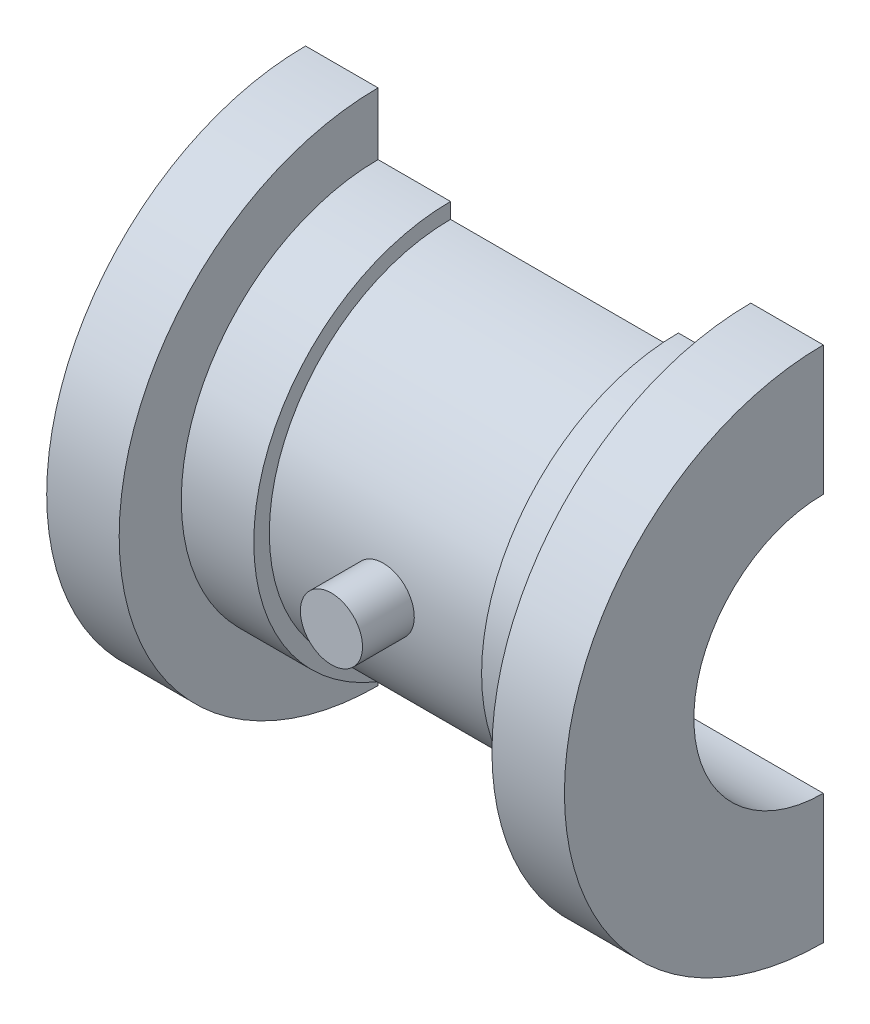
ISO-10303-21;
HEADER;
FILE_DESCRIPTION(('STEP AP214'),'2;1');
FILE_NAME('part.step','',(''),(''),'','','');
FILE_SCHEMA(('AUTOMOTIVE_DESIGN { 1 0 10303 214 1 1 1 1 }'));
ENDSEC;
DATA;
#1=APPLICATION_CONTEXT('core data for automotive mechanical design processes');
#2=APPLICATION_PROTOCOL_DEFINITION('international standard','automotive_design',2000,#1);
#3=PRODUCT_CONTEXT('',#1,'mechanical');
#4=PRODUCT('Part','Part','',(#3));
#5=PRODUCT_RELATED_PRODUCT_CATEGORY('part','',(#4));
#6=PRODUCT_DEFINITION_FORMATION('','',#4);
#7=PRODUCT_DEFINITION_CONTEXT('part definition',#1,'design');
#8=PRODUCT_DEFINITION('design','',#6,#7);
#9=PRODUCT_DEFINITION_SHAPE('','',#8);
#10=(LENGTH_UNIT() NAMED_UNIT(*) SI_UNIT(.MILLI.,.METRE.));
#11=(NAMED_UNIT(*) PLANE_ANGLE_UNIT() SI_UNIT($,.RADIAN.));
#12=(NAMED_UNIT(*) SI_UNIT($,.STERADIAN.) SOLID_ANGLE_UNIT());
#13=UNCERTAINTY_MEASURE_WITH_UNIT(LENGTH_MEASURE(1.E-05),#10,'distance_accuracy_value','');
#14=(GEOMETRIC_REPRESENTATION_CONTEXT(3) GLOBAL_UNCERTAINTY_ASSIGNED_CONTEXT((#13)) GLOBAL_UNIT_ASSIGNED_CONTEXT((#10,
#11,#12)) REPRESENTATION_CONTEXT('',''));
#15=CARTESIAN_POINT('',(0.,0.,0.));
#16=DIRECTION('',(0.,0.,1.));
#17=DIRECTION('',(1.,0.,0.));
#18=AXIS2_PLACEMENT_3D('',#15,#16,#17);
#19=CARTESIAN_POINT('',(0.,-1.57116660247941E-13,22.5));
#20=DIRECTION('',(0.,0.,-1.));
#21=DIRECTION('',(0.,1.,0.));
#22=AXIS2_PLACEMENT_3D('',#19,#20,#21);
#23=CYLINDRICAL_SURFACE('',#22,3.);
#24=CARTESIAN_POINT('',(0.,-1.57116660247941E-13,22.5));
#25=DIRECTION('',(0.,0.,-1.));
#26=DIRECTION('',(0.,1.,0.));
#27=AXIS2_PLACEMENT_3D('',#24,#25,#26);
#28=CIRCLE('',#27,3.);
#29=CARTESIAN_POINT('',(0.,2.99999999999984,22.5));
#30=VERTEX_POINT('',#29);
#31=EDGE_CURVE('E11',#30,#30,#28,.T.);
#32=ORIENTED_EDGE('',*,*,#31,.T.);
#33=EDGE_LOOP('',(#32));
#34=FACE_BOUND('',#33,.T.);
#35=CARTESIAN_POINT('',(0.,-1.2220184685951E-13,17.5));
#36=DIRECTION('',(0.,0.,-1.));
#37=DIRECTION('',(0.,1.,0.));
#38=AXIS2_PLACEMENT_3D('',#35,#36,#37);
#39=CIRCLE('',#38,3.);
#40=CARTESIAN_POINT('',(0.,2.99999999999988,17.5));
#41=VERTEX_POINT('',#40);
#42=EDGE_CURVE('E48',#41,#41,#39,.T.);
#43=ORIENTED_EDGE('',*,*,#42,.F.);
#44=EDGE_LOOP('',(#43));
#45=FACE_BOUND('',#44,.T.);
#46=ADVANCED_FACE('F45',(#34,#45),#23,.T.);
#47=CARTESIAN_POINT('',(0.,-1.57116660247941E-13,22.5));
#48=DIRECTION('',(0.,0.,-1.));
#49=DIRECTION('',(0.,1.,0.));
#50=AXIS2_PLACEMENT_3D('',#47,#48,#49);
#51=PLANE('',#50);
#52=ORIENTED_EDGE('',*,*,#31,.F.);
#53=EDGE_LOOP('',(#52));
#54=FACE_BOUND('',#53,.T.);
#55=ADVANCED_FACE('F60',(#54),#51,.F.);
#56=CARTESIAN_POINT('',(0.,-1.2220184685951E-13,17.5));
#57=DIRECTION('',(0.,0.,-1.));
#58=DIRECTION('',(0.,1.,0.));
#59=AXIS2_PLACEMENT_3D('',#56,#57,#58);
#60=PLANE('',#59);
#61=ORIENTED_EDGE('',*,*,#42,.T.);
#62=EDGE_LOOP('',(#61));
#63=FACE_BOUND('',#62,.T.);
#64=ADVANCED_FACE('F57',(#63),#60,.T.);
#65=CLOSED_SHELL('',(#46,#55,#64));
#66=MANIFOLD_SOLID_BREP('B2',#65);
#67=CARTESIAN_POINT('',(0.,0.,0.));
#68=DIRECTION('',(0.,0.,1.));
#69=DIRECTION('',(-1.,0.,0.));
#70=AXIS2_PLACEMENT_3D('',#67,#68,#69);
#71=PLANE('',#70);
#72=DIRECTION('',(0.,-1.,0.));
#73=VECTOR('',#72,1.);
#74=CARTESIAN_POINT('',(25.,0.,0.));
#75=LINE('',#74,#73);
#76=CARTESIAN_POINT('',(25.,25.,0.));
#77=VERTEX_POINT('',#76);
#78=CARTESIAN_POINT('',(25.,12.5,-1.74574066942157E-13));
#79=VERTEX_POINT('',#78);
#80=EDGE_CURVE('E180',#77,#79,#75,.T.);
#81=ORIENTED_EDGE('',*,*,#80,.T.);
#82=DIRECTION('',(-1.,0.,0.));
#83=VECTOR('',#82,1.);
#84=CARTESIAN_POINT('',(25.,12.5,-1.74574066942157E-13));
#85=LINE('',#84,#83);
#86=CARTESIAN_POINT('',(-25.,12.5,-1.74574066942157E-13));
#87=VERTEX_POINT('',#86);
#88=EDGE_CURVE('E167',#79,#87,#85,.T.);
#89=ORIENTED_EDGE('',*,*,#88,.T.);
#90=DIRECTION('',(0.,1.,0.));
#91=VECTOR('',#90,1.);
#92=CARTESIAN_POINT('',(-25.,0.,0.));
#93=LINE('',#92,#91);
#94=CARTESIAN_POINT('',(-25.,25.,0.));
#95=VERTEX_POINT('',#94);
#96=EDGE_CURVE('E246',#87,#95,#93,.T.);
#97=ORIENTED_EDGE('',*,*,#96,.T.);
#98=DIRECTION('',(-1.,0.,0.));
#99=VECTOR('',#98,1.);
#100=CARTESIAN_POINT('',(-25.,25.,0.));
#101=LINE('',#100,#99);
#102=CARTESIAN_POINT('',(-18.,25.,0.));
#103=VERTEX_POINT('',#102);
#104=EDGE_CURVE('E236',#103,#95,#101,.T.);
#105=ORIENTED_EDGE('',*,*,#104,.F.);
#106=DIRECTION('',(0.,1.,0.));
#107=VECTOR('',#106,1.);
#108=CARTESIAN_POINT('',(-18.,25.,0.));
#109=LINE('',#108,#107);
#110=CARTESIAN_POINT('',(-18.,19.,0.));
#111=VERTEX_POINT('',#110);
#112=EDGE_CURVE('E240',#111,#103,#109,.T.);
#113=ORIENTED_EDGE('',*,*,#112,.F.);
#114=DIRECTION('',(-1.,0.,0.));
#115=VECTOR('',#114,1.);
#116=CARTESIAN_POINT('',(-18.,19.,0.));
#117=LINE('',#116,#115);
#118=CARTESIAN_POINT('',(-11.,19.,0.));
#119=VERTEX_POINT('',#118);
#120=EDGE_CURVE('E244',#119,#111,#117,.T.);
#121=ORIENTED_EDGE('',*,*,#120,.F.);
#122=DIRECTION('',(0.,1.,0.));
#123=VECTOR('',#122,1.);
#124=CARTESIAN_POINT('',(-11.,19.,0.));
#125=LINE('',#124,#123);
#126=CARTESIAN_POINT('',(-11.,17.5,0.));
#127=VERTEX_POINT('',#126);
#128=EDGE_CURVE('E249',#127,#119,#125,.T.);
#129=ORIENTED_EDGE('',*,*,#128,.F.);
#130=DIRECTION('',(-1.,0.,0.));
#131=VECTOR('',#130,1.);
#132=CARTESIAN_POINT('',(-11.,17.5,0.));
#133=LINE('',#132,#131);
#134=CARTESIAN_POINT('',(11.,17.5,0.));
#135=VERTEX_POINT('',#134);
#136=EDGE_CURVE('E252',#135,#127,#133,.T.);
#137=ORIENTED_EDGE('',*,*,#136,.F.);
#138=DIRECTION('',(0.,-1.,0.));
#139=VECTOR('',#138,1.);
#140=CARTESIAN_POINT('',(11.,19.,0.));
#141=LINE('',#140,#139);
#142=CARTESIAN_POINT('',(11.,19.,0.));
#143=VERTEX_POINT('',#142);
#144=EDGE_CURVE('E255',#143,#135,#141,.T.);
#145=ORIENTED_EDGE('',*,*,#144,.F.);
#146=DIRECTION('',(-1.,0.,0.));
#147=VECTOR('',#146,1.);
#148=CARTESIAN_POINT('',(18.,19.,0.));
#149=LINE('',#148,#147);
#150=CARTESIAN_POINT('',(18.,19.,0.));
#151=VERTEX_POINT('',#150);
#152=EDGE_CURVE('E258',#151,#143,#149,.T.);
#153=ORIENTED_EDGE('',*,*,#152,.F.);
#154=DIRECTION('',(0.,-1.,0.));
#155=VECTOR('',#154,1.);
#156=CARTESIAN_POINT('',(18.,25.,0.));
#157=LINE('',#156,#155);
#158=CARTESIAN_POINT('',(18.,25.,0.));
#159=VERTEX_POINT('',#158);
#160=EDGE_CURVE('E261',#159,#151,#157,.T.);
#161=ORIENTED_EDGE('',*,*,#160,.F.);
#162=DIRECTION('',(-1.,0.,0.));
#163=VECTOR('',#162,1.);
#164=CARTESIAN_POINT('',(25.,25.,0.));
#165=LINE('',#164,#163);
#166=EDGE_CURVE('E187',#77,#159,#165,.T.);
#167=ORIENTED_EDGE('',*,*,#166,.F.);
#168=EDGE_LOOP('',(#81,#89,#97,#105,#113,#121,#129,#137,#145,#153,#161,#167));
#169=FACE_BOUND('',#168,.T.);
#170=ADVANCED_FACE('F80',(#169),#71,.F.);
#171=CARTESIAN_POINT('',(-25.,0.,0.));
#172=DIRECTION('',(1.,0.,0.));
#173=DIRECTION('',(0.,1.,0.));
#174=AXIS2_PLACEMENT_3D('',#171,#172,#173);
#175=PLANE('',#174);
#176=ORIENTED_EDGE('',*,*,#96,.F.);
#177=CARTESIAN_POINT('',(-25.,0.,0.));
#178=DIRECTION('',(-1.,0.,0.));
#179=DIRECTION('',(0.,-1.,0.));
#180=AXIS2_PLACEMENT_3D('',#177,#178,#179);
#181=CIRCLE('',#180,12.5);
#182=CARTESIAN_POINT('',(-25.,-12.5,-1.74574066942157E-13));
#183=VERTEX_POINT('',#182);
#184=EDGE_CURVE('E170',#183,#87,#181,.T.);
#185=ORIENTED_EDGE('',*,*,#184,.F.);
#186=CARTESIAN_POINT('',(-25.,-25.,-1.74574066942157E-13));
#187=VERTEX_POINT('',#186);
#188=EDGE_CURVE('E193',#187,#183,#93,.T.);
#189=ORIENTED_EDGE('',*,*,#188,.F.);
#190=CARTESIAN_POINT('',(-25.,0.,0.));
#191=DIRECTION('',(-1.,0.,0.));
#192=DIRECTION('',(0.,-1.,0.));
#193=AXIS2_PLACEMENT_3D('',#190,#191,#192);
#194=CIRCLE('',#193,25.);
#195=EDGE_CURVE('E43',#187,#95,#194,.T.);
#196=ORIENTED_EDGE('',*,*,#195,.T.);
#197=EDGE_LOOP('',(#176,#185,#189,#196));
#198=FACE_BOUND('',#197,.T.);
#199=ADVANCED_FACE('F270',(#198),#175,.F.);
#200=CARTESIAN_POINT('',(-38.9493607052265,0.,0.));
#201=DIRECTION('',(-1.,0.,0.));
#202=DIRECTION('',(0.,-1.,0.));
#203=AXIS2_PLACEMENT_3D('',#200,#201,#202);
#204=CYLINDRICAL_SURFACE('',#203,25.);
#205=CARTESIAN_POINT('',(-18.,0.,0.));
#206=DIRECTION('',(-1.,0.,0.));
#207=DIRECTION('',(0.,-1.,0.));
#208=AXIS2_PLACEMENT_3D('',#205,#206,#207);
#209=CIRCLE('',#208,25.);
#210=CARTESIAN_POINT('',(-18.,-25.,-1.74574066942157E-13));
#211=VERTEX_POINT('',#210);
#212=EDGE_CURVE('E88',#211,#103,#209,.T.);
#213=ORIENTED_EDGE('',*,*,#212,.T.);
#214=ORIENTED_EDGE('',*,*,#104,.T.);
#215=ORIENTED_EDGE('',*,*,#195,.F.);
#216=DIRECTION('',(-1.,0.,0.));
#217=VECTOR('',#216,1.);
#218=CARTESIAN_POINT('',(-25.,-25.,-1.74574066942157E-13));
#219=LINE('',#218,#217);
#220=EDGE_CURVE('E217',#211,#187,#219,.T.);
#221=ORIENTED_EDGE('',*,*,#220,.F.);
#222=EDGE_LOOP('',(#213,#214,#215,#221));
#223=FACE_BOUND('',#222,.T.);
#224=ADVANCED_FACE('F82',(#223),#204,.T.);
#225=CARTESIAN_POINT('',(-18.,-25.,-1.74574066942157E-13));
#226=DIRECTION('',(-1.,0.,0.));
#227=DIRECTION('',(0.,-1.,0.));
#228=AXIS2_PLACEMENT_3D('',#225,#226,#227);
#229=PLANE('',#228);
#230=CARTESIAN_POINT('',(-18.,0.,0.));
#231=DIRECTION('',(-1.,0.,0.));
#232=DIRECTION('',(0.,-1.,0.));
#233=AXIS2_PLACEMENT_3D('',#230,#231,#232);
#234=CIRCLE('',#233,19.);
#235=CARTESIAN_POINT('',(-18.,-19.,-1.32676290876039E-13));
#236=VERTEX_POINT('',#235);
#237=EDGE_CURVE('E233',#236,#111,#234,.T.);
#238=ORIENTED_EDGE('',*,*,#237,.T.);
#239=ORIENTED_EDGE('',*,*,#112,.T.);
#240=ORIENTED_EDGE('',*,*,#212,.F.);
#241=DIRECTION('',(0.,-1.,0.));
#242=VECTOR('',#241,1.);
#243=CARTESIAN_POINT('',(-18.,-25.,-1.74574066942157E-13));
#244=LINE('',#243,#242);
#245=EDGE_CURVE('E214',#236,#211,#244,.T.);
#246=ORIENTED_EDGE('',*,*,#245,.F.);
#247=EDGE_LOOP('',(#238,#239,#240,#246));
#248=FACE_BOUND('',#247,.T.);
#249=ADVANCED_FACE('F241',(#248),#229,.F.);
#250=CARTESIAN_POINT('',(-38.9493607052265,0.,0.));
#251=DIRECTION('',(-1.,0.,0.));
#252=DIRECTION('',(0.,-1.,0.));
#253=AXIS2_PLACEMENT_3D('',#250,#251,#252);
#254=CYLINDRICAL_SURFACE('',#253,19.);
#255=CARTESIAN_POINT('',(-11.,0.,0.));
#256=DIRECTION('',(-1.,0.,0.));
#257=DIRECTION('',(0.,-1.,0.));
#258=AXIS2_PLACEMENT_3D('',#255,#256,#257);
#259=CIRCLE('',#258,19.);
#260=CARTESIAN_POINT('',(-11.,-19.,-1.32676290876039E-13));
#261=VERTEX_POINT('',#260);
#262=EDGE_CURVE('E231',#261,#119,#259,.T.);
#263=ORIENTED_EDGE('',*,*,#262,.T.);
#264=ORIENTED_EDGE('',*,*,#120,.T.);
#265=ORIENTED_EDGE('',*,*,#237,.F.);
#266=DIRECTION('',(-1.,0.,0.));
#267=VECTOR('',#266,1.);
#268=CARTESIAN_POINT('',(-18.,-19.,-1.32676290876039E-13));
#269=LINE('',#268,#267);
#270=EDGE_CURVE('E211',#261,#236,#269,.T.);
#271=ORIENTED_EDGE('',*,*,#270,.F.);
#272=EDGE_LOOP('',(#263,#264,#265,#271));
#273=FACE_BOUND('',#272,.T.);
#274=ADVANCED_FACE('F275',(#273),#254,.T.);
#275=CARTESIAN_POINT('',(-11.,-19.,-1.32676290876039E-13));
#276=DIRECTION('',(-1.,0.,0.));
#277=DIRECTION('',(0.,-1.,0.));
#278=AXIS2_PLACEMENT_3D('',#275,#276,#277);
#279=PLANE('',#278);
#280=CARTESIAN_POINT('',(-11.,0.,0.));
#281=DIRECTION('',(-1.,0.,0.));
#282=DIRECTION('',(0.,-1.,0.));
#283=AXIS2_PLACEMENT_3D('',#280,#281,#282);
#284=CIRCLE('',#283,17.5);
#285=CARTESIAN_POINT('',(-11.,-17.5,-1.2220184685951E-13));
#286=VERTEX_POINT('',#285);
#287=EDGE_CURVE('E229',#286,#127,#284,.T.);
#288=ORIENTED_EDGE('',*,*,#287,.T.);
#289=ORIENTED_EDGE('',*,*,#128,.T.);
#290=ORIENTED_EDGE('',*,*,#262,.F.);
#291=DIRECTION('',(0.,-1.,0.));
#292=VECTOR('',#291,1.);
#293=CARTESIAN_POINT('',(-11.,-19.,-1.32676290876039E-13));
#294=LINE('',#293,#292);
#295=EDGE_CURVE('E208',#286,#261,#294,.T.);
#296=ORIENTED_EDGE('',*,*,#295,.F.);
#297=EDGE_LOOP('',(#288,#289,#290,#296));
#298=FACE_BOUND('',#297,.T.);
#299=ADVANCED_FACE('F280',(#298),#279,.F.);
#300=CARTESIAN_POINT('',(-38.9493607052265,0.,0.));
#301=DIRECTION('',(-1.,0.,0.));
#302=DIRECTION('',(0.,-1.,0.));
#303=AXIS2_PLACEMENT_3D('',#300,#301,#302);
#304=CYLINDRICAL_SURFACE('',#303,17.5);
#305=CARTESIAN_POINT('',(11.,0.,0.));
#306=DIRECTION('',(-1.,0.,0.));
#307=DIRECTION('',(0.,-1.,0.));
#308=AXIS2_PLACEMENT_3D('',#305,#306,#307);
#309=CIRCLE('',#308,17.5);
#310=CARTESIAN_POINT('',(11.,-17.5,-1.2220184685951E-13));
#311=VERTEX_POINT('',#310);
#312=EDGE_CURVE('E227',#311,#135,#309,.T.);
#313=ORIENTED_EDGE('',*,*,#312,.T.);
#314=ORIENTED_EDGE('',*,*,#136,.T.);
#315=ORIENTED_EDGE('',*,*,#287,.F.);
#316=DIRECTION('',(-1.,0.,0.));
#317=VECTOR('',#316,1.);
#318=CARTESIAN_POINT('',(-11.,-17.5,-1.2220184685951E-13));
#319=LINE('',#318,#317);
#320=EDGE_CURVE('E205',#311,#286,#319,.T.);
#321=ORIENTED_EDGE('',*,*,#320,.F.);
#322=EDGE_LOOP('',(#313,#314,#315,#321));
#323=FACE_BOUND('',#322,.T.);
#324=ADVANCED_FACE('F283',(#323),#304,.T.);
#325=CARTESIAN_POINT('',(11.,-19.,-1.32676290876039E-13));
#326=DIRECTION('',(1.,0.,0.));
#327=DIRECTION('',(0.,1.,0.));
#328=AXIS2_PLACEMENT_3D('',#325,#326,#327);
#329=PLANE('',#328);
#330=CARTESIAN_POINT('',(11.,0.,0.));
#331=DIRECTION('',(-1.,0.,0.));
#332=DIRECTION('',(0.,-1.,0.));
#333=AXIS2_PLACEMENT_3D('',#330,#331,#332);
#334=CIRCLE('',#333,19.);
#335=CARTESIAN_POINT('',(11.,-19.,-1.32676290876039E-13));
#336=VERTEX_POINT('',#335);
#337=EDGE_CURVE('E225',#336,#143,#334,.T.);
#338=ORIENTED_EDGE('',*,*,#337,.T.);
#339=ORIENTED_EDGE('',*,*,#144,.T.);
#340=ORIENTED_EDGE('',*,*,#312,.F.);
#341=DIRECTION('',(0.,1.,0.));
#342=VECTOR('',#341,1.);
#343=CARTESIAN_POINT('',(11.,-19.,-1.32676290876039E-13));
#344=LINE('',#343,#342);
#345=EDGE_CURVE('E202',#336,#311,#344,.T.);
#346=ORIENTED_EDGE('',*,*,#345,.F.);
#347=EDGE_LOOP('',(#338,#339,#340,#346));
#348=FACE_BOUND('',#347,.T.);
#349=ADVANCED_FACE('F286',(#348),#329,.F.);
#350=CARTESIAN_POINT('',(-38.9493607052265,0.,0.));
#351=DIRECTION('',(-1.,0.,0.));
#352=DIRECTION('',(0.,-1.,0.));
#353=AXIS2_PLACEMENT_3D('',#350,#351,#352);
#354=CYLINDRICAL_SURFACE('',#353,19.);
#355=CARTESIAN_POINT('',(18.,0.,0.));
#356=DIRECTION('',(-1.,0.,0.));
#357=DIRECTION('',(0.,-1.,0.));
#358=AXIS2_PLACEMENT_3D('',#355,#356,#357);
#359=CIRCLE('',#358,19.);
#360=CARTESIAN_POINT('',(18.,-19.,-1.32676290876039E-13));
#361=VERTEX_POINT('',#360);
#362=EDGE_CURVE('E223',#361,#151,#359,.T.);
#363=ORIENTED_EDGE('',*,*,#362,.T.);
#364=ORIENTED_EDGE('',*,*,#152,.T.);
#365=ORIENTED_EDGE('',*,*,#337,.F.);
#366=DIRECTION('',(-1.,0.,0.));
#367=VECTOR('',#366,1.);
#368=CARTESIAN_POINT('',(18.,-19.,-1.32676290876039E-13));
#369=LINE('',#368,#367);
#370=EDGE_CURVE('E199',#361,#336,#369,.T.);
#371=ORIENTED_EDGE('',*,*,#370,.F.);
#372=EDGE_LOOP('',(#363,#364,#365,#371));
#373=FACE_BOUND('',#372,.T.);
#374=ADVANCED_FACE('F289',(#373),#354,.T.);
#375=CARTESIAN_POINT('',(18.,-25.,-1.74574066942157E-13));
#376=DIRECTION('',(1.,0.,0.));
#377=DIRECTION('',(0.,1.,0.));
#378=AXIS2_PLACEMENT_3D('',#375,#376,#377);
#379=PLANE('',#378);
#380=CARTESIAN_POINT('',(18.,0.,0.));
#381=DIRECTION('',(-1.,0.,0.));
#382=DIRECTION('',(0.,-1.,0.));
#383=AXIS2_PLACEMENT_3D('',#380,#381,#382);
#384=CIRCLE('',#383,25.);
#385=CARTESIAN_POINT('',(18.,-25.,-1.74574066942157E-13));
#386=VERTEX_POINT('',#385);
#387=EDGE_CURVE('E221',#386,#159,#384,.T.);
#388=ORIENTED_EDGE('',*,*,#387,.T.);
#389=ORIENTED_EDGE('',*,*,#160,.T.);
#390=ORIENTED_EDGE('',*,*,#362,.F.);
#391=DIRECTION('',(0.,1.,0.));
#392=VECTOR('',#391,1.);
#393=CARTESIAN_POINT('',(18.,-25.,-1.74574066942157E-13));
#394=LINE('',#393,#392);
#395=EDGE_CURVE('E191',#386,#361,#394,.T.);
#396=ORIENTED_EDGE('',*,*,#395,.F.);
#397=EDGE_LOOP('',(#388,#389,#390,#396));
#398=FACE_BOUND('',#397,.T.);
#399=ADVANCED_FACE('F293',(#398),#379,.F.);
#400=CARTESIAN_POINT('',(-38.9493607052265,0.,0.));
#401=DIRECTION('',(-1.,0.,0.));
#402=DIRECTION('',(0.,-1.,0.));
#403=AXIS2_PLACEMENT_3D('',#400,#401,#402);
#404=CYLINDRICAL_SURFACE('',#403,25.);
#405=CARTESIAN_POINT('',(25.,0.,0.));
#406=DIRECTION('',(-1.,0.,0.));
#407=DIRECTION('',(0.,-1.,0.));
#408=AXIS2_PLACEMENT_3D('',#405,#406,#407);
#409=CIRCLE('',#408,25.);
#410=CARTESIAN_POINT('',(25.,-25.,-1.74574066942157E-13));
#411=VERTEX_POINT('',#410);
#412=EDGE_CURVE('E219',#411,#77,#409,.T.);
#413=ORIENTED_EDGE('',*,*,#412,.T.);
#414=ORIENTED_EDGE('',*,*,#166,.T.);
#415=ORIENTED_EDGE('',*,*,#387,.F.);
#416=DIRECTION('',(-1.,0.,0.));
#417=VECTOR('',#416,1.);
#418=CARTESIAN_POINT('',(25.,-25.,-1.74574066942157E-13));
#419=LINE('',#418,#417);
#420=EDGE_CURVE('E188',#411,#386,#419,.T.);
#421=ORIENTED_EDGE('',*,*,#420,.F.);
#422=EDGE_LOOP('',(#413,#414,#415,#421));
#423=FACE_BOUND('',#422,.T.);
#424=ADVANCED_FACE('F296',(#423),#404,.T.);
#425=CARTESIAN_POINT('',(25.,0.,0.));
#426=DIRECTION('',(-1.,0.,0.));
#427=DIRECTION('',(0.,-1.,0.));
#428=AXIS2_PLACEMENT_3D('',#425,#426,#427);
#429=PLANE('',#428);
#430=CARTESIAN_POINT('',(25.,-12.5,0.));
#431=VERTEX_POINT('',#430);
#432=EDGE_CURVE('E182',#431,#411,#75,.T.);
#433=ORIENTED_EDGE('',*,*,#432,.F.);
#434=CARTESIAN_POINT('',(25.,0.,0.));
#435=DIRECTION('',(-1.,0.,0.));
#436=DIRECTION('',(0.,-1.,0.));
#437=AXIS2_PLACEMENT_3D('',#434,#435,#436);
#438=CIRCLE('',#437,12.5);
#439=EDGE_CURVE('E95',#431,#79,#438,.T.);
#440=ORIENTED_EDGE('',*,*,#439,.T.);
#441=ORIENTED_EDGE('',*,*,#80,.F.);
#442=ORIENTED_EDGE('',*,*,#412,.F.);
#443=EDGE_LOOP('',(#433,#440,#441,#442));
#444=FACE_BOUND('',#443,.T.);
#445=ADVANCED_FACE('F178',(#444),#429,.F.);
#446=ORIENTED_EDGE('',*,*,#188,.T.);
#447=DIRECTION('',(-1.,0.,0.));
#448=VECTOR('',#447,1.);
#449=CARTESIAN_POINT('',(25.,-12.5,-1.74574066942157E-13));
#450=LINE('',#449,#448);
#451=EDGE_CURVE('E174',#431,#183,#450,.T.);
#452=ORIENTED_EDGE('',*,*,#451,.F.);
#453=ORIENTED_EDGE('',*,*,#432,.T.);
#454=ORIENTED_EDGE('',*,*,#420,.T.);
#455=ORIENTED_EDGE('',*,*,#395,.T.);
#456=ORIENTED_EDGE('',*,*,#370,.T.);
#457=ORIENTED_EDGE('',*,*,#345,.T.);
#458=ORIENTED_EDGE('',*,*,#320,.T.);
#459=ORIENTED_EDGE('',*,*,#295,.T.);
#460=ORIENTED_EDGE('',*,*,#270,.T.);
#461=ORIENTED_EDGE('',*,*,#245,.T.);
#462=ORIENTED_EDGE('',*,*,#220,.T.);
#463=EDGE_LOOP('',(#446,#452,#453,#454,#455,#456,#457,#458,#459,#460,#461,#462));
#464=FACE_BOUND('',#463,.T.);
#465=ADVANCED_FACE('F271',(#464),#71,.F.);
#466=CARTESIAN_POINT('',(25.,0.,0.));
#467=DIRECTION('',(-1.,0.,0.));
#468=DIRECTION('',(0.,-1.,0.));
#469=AXIS2_PLACEMENT_3D('',#466,#467,#468);
#470=CYLINDRICAL_SURFACE('',#469,12.5);
#471=ORIENTED_EDGE('',*,*,#184,.T.);
#472=ORIENTED_EDGE('',*,*,#88,.F.);
#473=ORIENTED_EDGE('',*,*,#439,.F.);
#474=ORIENTED_EDGE('',*,*,#451,.T.);
#475=EDGE_LOOP('',(#471,#472,#473,#474));
#476=FACE_BOUND('',#475,.T.);
#477=ADVANCED_FACE('F168',(#476),#470,.F.);
#478=CLOSED_SHELL('',(#170,#199,#224,#249,#274,#299,#324,#349,#374,#399,#424,#445,#465,#477));
#479=MANIFOLD_SOLID_BREP('B6',#478);
#480=ADVANCED_BREP_SHAPE_REPRESENTATION('',(#18,#66,#479),#14);
#481=SHAPE_DEFINITION_REPRESENTATION(#9,#480);
ENDSEC;
END-ISO-10303-21;
